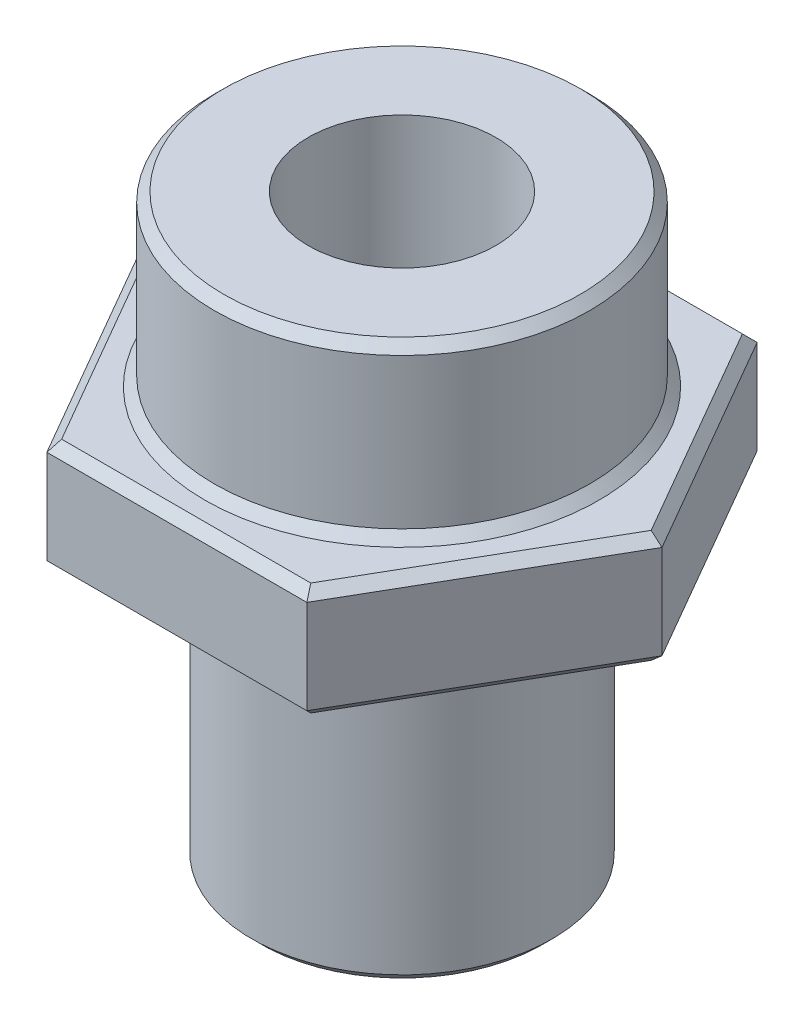
ISO-10303-21;
HEADER;
FILE_DESCRIPTION(('STEP AP214'),'2;1');
FILE_NAME('part.step','',(''),(''),'','','');
FILE_SCHEMA(('AUTOMOTIVE_DESIGN { 1 0 10303 214 1 1 1 1 }'));
ENDSEC;
DATA;
#1=APPLICATION_CONTEXT('core data for automotive mechanical design processes');
#2=APPLICATION_PROTOCOL_DEFINITION('international standard','automotive_design',2000,#1);
#3=PRODUCT_CONTEXT('',#1,'mechanical');
#4=PRODUCT('Part','Part','',(#3));
#5=PRODUCT_RELATED_PRODUCT_CATEGORY('part','',(#4));
#6=PRODUCT_DEFINITION_FORMATION('','',#4);
#7=PRODUCT_DEFINITION_CONTEXT('part definition',#1,'design');
#8=PRODUCT_DEFINITION('design','',#6,#7);
#9=PRODUCT_DEFINITION_SHAPE('','',#8);
#10=(LENGTH_UNIT() NAMED_UNIT(*) SI_UNIT(.MILLI.,.METRE.));
#11=(NAMED_UNIT(*) PLANE_ANGLE_UNIT() SI_UNIT($,.RADIAN.));
#12=(NAMED_UNIT(*) SI_UNIT($,.STERADIAN.) SOLID_ANGLE_UNIT());
#13=UNCERTAINTY_MEASURE_WITH_UNIT(LENGTH_MEASURE(1.E-05),#10,'distance_accuracy_value','');
#14=(GEOMETRIC_REPRESENTATION_CONTEXT(3) GLOBAL_UNCERTAINTY_ASSIGNED_CONTEXT((#13)) GLOBAL_UNIT_ASSIGNED_CONTEXT((#10,
#11,#12)) REPRESENTATION_CONTEXT('',''));
#15=CARTESIAN_POINT('',(0.,0.,0.));
#16=DIRECTION('',(0.,0.,1.));
#17=DIRECTION('',(1.,0.,0.));
#18=AXIS2_PLACEMENT_3D('',#15,#16,#17);
#19=CARTESIAN_POINT('',(0.,0.,0.));
#20=DIRECTION('',(0.,1.,0.));
#21=DIRECTION('',(0.,0.,1.));
#22=AXIS2_PLACEMENT_3D('',#19,#20,#21);
#23=CYLINDRICAL_SURFACE('',#22,2.5);
#24=CARTESIAN_POINT('',(0.,-7.5,0.));
#25=DIRECTION('',(0.,-1.,0.));
#26=DIRECTION('',(0.,0.,-1.));
#27=AXIS2_PLACEMENT_3D('',#24,#25,#26);
#28=CIRCLE('',#27,2.5);
#29=CARTESIAN_POINT('',(0.,-7.5,-2.5));
#30=VERTEX_POINT('',#29);
#31=EDGE_CURVE('E342',#30,#30,#28,.T.);
#32=ORIENTED_EDGE('',*,*,#31,.F.);
#33=EDGE_LOOP('',(#32));
#34=FACE_BOUND('',#33,.T.);
#35=CARTESIAN_POINT('',(0.,-15.5,0.));
#36=DIRECTION('',(0.,1.,0.));
#37=DIRECTION('',(0.,0.,1.));
#38=AXIS2_PLACEMENT_3D('',#35,#36,#37);
#39=CIRCLE('',#38,2.5);
#40=CARTESIAN_POINT('',(0.,-15.5,2.5));
#41=VERTEX_POINT('',#40);
#42=EDGE_CURVE('E341',#41,#41,#39,.T.);
#43=ORIENTED_EDGE('',*,*,#42,.F.);
#44=EDGE_LOOP('',(#43));
#45=FACE_BOUND('',#44,.T.);
#46=ADVANCED_FACE('F45',(#34,#45),#23,.F.);
#47=CARTESIAN_POINT('',(-6.,-7.5,0.));
#48=DIRECTION('',(0.,-1.,0.));
#49=DIRECTION('',(0.,0.,-1.));
#50=AXIS2_PLACEMENT_3D('',#47,#48,#49);
#51=PLANE('',#50);
#52=DIRECTION('',(0.5,0.,0.866025403784439));
#53=VECTOR('',#52,1.);
#54=CARTESIAN_POINT('',(3.47964607176053,-7.5,-5.47307621135332));
#55=LINE('',#54,#53);
#56=CARTESIAN_POINT('',(3.31976404784035,-7.5,-5.75000000000001));
#57=VERTEX_POINT('',#56);
#58=CARTESIAN_POINT('',(6.6395280956807,-7.5,0.));
#59=VERTEX_POINT('',#58);
#60=EDGE_CURVE('E216',#57,#59,#55,.T.);
#61=ORIENTED_EDGE('',*,*,#60,.T.);
#62=DIRECTION('',(-0.5,0.,0.866025403784439));
#63=VECTOR('',#62,1.);
#64=CARTESIAN_POINT('',(3.47964607176053,-7.5,5.47307621135332));
#65=LINE('',#64,#63);
#66=CARTESIAN_POINT('',(3.31976404784035,-7.5,5.75));
#67=VERTEX_POINT('',#66);
#68=EDGE_CURVE('E230',#59,#67,#65,.T.);
#69=ORIENTED_EDGE('',*,*,#68,.T.);
#70=DIRECTION('',(-1.,0.,0.));
#71=VECTOR('',#70,1.);
#72=CARTESIAN_POINT('',(-6.,-7.5,5.75));
#73=LINE('',#72,#71);
#74=CARTESIAN_POINT('',(-3.31976404784035,-7.5,5.75));
#75=VERTEX_POINT('',#74);
#76=EDGE_CURVE('E71',#67,#75,#73,.T.);
#77=ORIENTED_EDGE('',*,*,#76,.T.);
#78=DIRECTION('',(-0.5,0.,-0.866025403784439));
#79=VECTOR('',#78,1.);
#80=CARTESIAN_POINT('',(-6.47964607176053,-7.5,0.276923788646686));
#81=LINE('',#80,#79);
#82=CARTESIAN_POINT('',(-6.6395280956807,-7.5,0.));
#83=VERTEX_POINT('',#82);
#84=EDGE_CURVE('E225',#75,#83,#81,.T.);
#85=ORIENTED_EDGE('',*,*,#84,.T.);
#86=DIRECTION('',(0.5,0.,-0.866025403784439));
#87=VECTOR('',#86,1.);
#88=CARTESIAN_POINT('',(-6.47964607176053,-7.5,-0.276923788646688));
#89=LINE('',#88,#87);
#90=CARTESIAN_POINT('',(-3.31976404784035,-7.5,-5.75000000000001));
#91=VERTEX_POINT('',#90);
#92=EDGE_CURVE('E222',#83,#91,#89,.T.);
#93=ORIENTED_EDGE('',*,*,#92,.T.);
#94=DIRECTION('',(1.,0.,0.));
#95=VECTOR('',#94,1.);
#96=CARTESIAN_POINT('',(-6.,-7.5,-5.75000000000001));
#97=LINE('',#96,#95);
#98=EDGE_CURVE('E219',#91,#57,#97,.T.);
#99=ORIENTED_EDGE('',*,*,#98,.T.);
#100=EDGE_LOOP('',(#61,#69,#77,#85,#93,#99));
#101=FACE_BOUND('',#100,.T.);
#102=CARTESIAN_POINT('',(0.,-7.5,0.));
#103=DIRECTION('',(0.,-1.,0.));
#104=DIRECTION('',(0.,0.,-1.));
#105=AXIS2_PLACEMENT_3D('',#102,#103,#104);
#106=CIRCLE('',#105,4.25);
#107=CARTESIAN_POINT('',(0.,-7.5,-4.25));
#108=VERTEX_POINT('',#107);
#109=EDGE_CURVE('E212',#108,#108,#106,.F.);
#110=ORIENTED_EDGE('',*,*,#109,.T.);
#111=EDGE_LOOP('',(#110));
#112=FACE_BOUND('',#111,.T.);
#113=ADVANCED_FACE('F299',(#101,#112),#51,.T.);
#114=CARTESIAN_POINT('',(0.,0.,0.));
#115=DIRECTION('',(0.,1.,0.));
#116=DIRECTION('',(0.,0.,1.));
#117=AXIS2_PLACEMENT_3D('',#114,#115,#116);
#118=CYLINDRICAL_SURFACE('',#117,4.);
#119=CARTESIAN_POINT('',(0.,-15.25,0.));
#120=DIRECTION('',(0.,-1.,0.));
#121=DIRECTION('',(0.,0.,-1.));
#122=AXIS2_PLACEMENT_3D('',#119,#120,#121);
#123=CIRCLE('',#122,4.);
#124=CARTESIAN_POINT('',(0.,-15.25,-4.));
#125=VERTEX_POINT('',#124);
#126=EDGE_CURVE('E237',#125,#125,#123,.F.);
#127=ORIENTED_EDGE('',*,*,#126,.T.);
#128=EDGE_LOOP('',(#127));
#129=FACE_BOUND('',#128,.T.);
#130=CARTESIAN_POINT('',(0.,-7.75,0.));
#131=DIRECTION('',(0.,-1.,0.));
#132=DIRECTION('',(0.,0.,-1.));
#133=AXIS2_PLACEMENT_3D('',#130,#131,#132);
#134=CIRCLE('',#133,4.);
#135=CARTESIAN_POINT('',(0.,-7.75,-4.));
#136=VERTEX_POINT('',#135);
#137=EDGE_CURVE('E233',#136,#136,#134,.T.);
#138=ORIENTED_EDGE('',*,*,#137,.T.);
#139=EDGE_LOOP('',(#138));
#140=FACE_BOUND('',#139,.T.);
#141=ADVANCED_FACE('F408',(#129,#140),#118,.T.);
#142=CARTESIAN_POINT('',(-4.,-15.5,0.));
#143=DIRECTION('',(0.,-1.,0.));
#144=DIRECTION('',(0.,0.,-1.));
#145=AXIS2_PLACEMENT_3D('',#142,#143,#144);
#146=PLANE('',#145);
#147=CARTESIAN_POINT('',(0.,-15.5,0.));
#148=DIRECTION('',(0.,-1.,0.));
#149=DIRECTION('',(0.,0.,-1.));
#150=AXIS2_PLACEMENT_3D('',#147,#148,#149);
#151=CIRCLE('',#150,3.75);
#152=CARTESIAN_POINT('',(0.,-15.5,-3.75));
#153=VERTEX_POINT('',#152);
#154=EDGE_CURVE('E241',#153,#153,#151,.T.);
#155=ORIENTED_EDGE('',*,*,#154,.T.);
#156=EDGE_LOOP('',(#155));
#157=FACE_BOUND('',#156,.T.);
#158=ORIENTED_EDGE('',*,*,#42,.T.);
#159=EDGE_LOOP('',(#158));
#160=FACE_BOUND('',#159,.T.);
#161=ADVANCED_FACE('F441',(#157,#160),#146,.T.);
#162=CARTESIAN_POINT('',(3.46410161513776,-25.8303027798234,-6.));
#163=DIRECTION('',(0.,0.,-1.));
#164=DIRECTION('',(-1.,0.,0.));
#165=AXIS2_PLACEMENT_3D('',#162,#163,#164);
#166=PLANE('',#165);
#167=DIRECTION('',(0.,1.,0.));
#168=VECTOR('',#167,1.);
#169=CARTESIAN_POINT('',(-3.46410161513776,-25.8303027798234,-6.));
#170=LINE('',#169,#168);
#171=CARTESIAN_POINT('',(-3.46410161513776,-7.25,-6.));
#172=VERTEX_POINT('',#171);
#173=CARTESIAN_POINT('',(-3.46410161513776,-4.75,-6.));
#174=VERTEX_POINT('',#173);
#175=EDGE_CURVE('E327',#172,#174,#170,.T.);
#176=ORIENTED_EDGE('',*,*,#175,.T.);
#177=DIRECTION('',(1.,0.,0.));
#178=VECTOR('',#177,1.);
#179=CARTESIAN_POINT('',(3.46410161513776,-4.75,-6.));
#180=LINE('',#179,#178);
#181=CARTESIAN_POINT('',(3.46410161513776,-4.75,-6.));
#182=VERTEX_POINT('',#181);
#183=EDGE_CURVE('E196',#174,#182,#180,.T.);
#184=ORIENTED_EDGE('',*,*,#183,.T.);
#185=DIRECTION('',(0.,1.,0.));
#186=VECTOR('',#185,1.);
#187=CARTESIAN_POINT('',(3.46410161513776,-25.8303027798234,-6.));
#188=LINE('',#187,#186);
#189=CARTESIAN_POINT('',(3.46410161513776,-7.25,-6.));
#190=VERTEX_POINT('',#189);
#191=EDGE_CURVE('E323',#190,#182,#188,.T.);
#192=ORIENTED_EDGE('',*,*,#191,.F.);
#193=DIRECTION('',(-1.,0.,0.));
#194=VECTOR('',#193,1.);
#195=CARTESIAN_POINT('',(3.46410161513776,-7.25,-6.));
#196=LINE('',#195,#194);
#197=EDGE_CURVE('E193',#190,#172,#196,.T.);
#198=ORIENTED_EDGE('',*,*,#197,.T.);
#199=EDGE_LOOP('',(#176,#184,#192,#198));
#200=FACE_BOUND('',#199,.T.);
#201=ADVANCED_FACE('F386',(#200),#166,.T.);
#202=CARTESIAN_POINT('',(6.92820323027551,-25.8303027798234,0.));
#203=DIRECTION('',(0.866025403784439,0.,-0.5));
#204=DIRECTION('',(-0.5,0.,-0.866025403784439));
#205=AXIS2_PLACEMENT_3D('',#202,#203,#204);
#206=PLANE('',#205);
#207=ORIENTED_EDGE('',*,*,#191,.T.);
#208=DIRECTION('',(0.5,0.,0.866025403784439));
#209=VECTOR('',#208,1.);
#210=CARTESIAN_POINT('',(6.92820323027551,-4.75,0.));
#211=LINE('',#210,#209);
#212=CARTESIAN_POINT('',(6.92820323027551,-4.75,0.));
#213=VERTEX_POINT('',#212);
#214=EDGE_CURVE('E202',#182,#213,#211,.T.);
#215=ORIENTED_EDGE('',*,*,#214,.T.);
#216=DIRECTION('',(0.,1.,0.));
#217=VECTOR('',#216,1.);
#218=CARTESIAN_POINT('',(6.92820323027551,-25.8303027798234,0.));
#219=LINE('',#218,#217);
#220=CARTESIAN_POINT('',(6.92820323027551,-7.25,0.));
#221=VERTEX_POINT('',#220);
#222=EDGE_CURVE('E314',#221,#213,#219,.T.);
#223=ORIENTED_EDGE('',*,*,#222,.F.);
#224=DIRECTION('',(-0.5,0.,-0.866025403784439));
#225=VECTOR('',#224,1.);
#226=CARTESIAN_POINT('',(6.92820323027551,-7.25,0.));
#227=LINE('',#226,#225);
#228=EDGE_CURVE('E199',#221,#190,#227,.T.);
#229=ORIENTED_EDGE('',*,*,#228,.T.);
#230=EDGE_LOOP('',(#207,#215,#223,#229));
#231=FACE_BOUND('',#230,.T.);
#232=ADVANCED_FACE('F319',(#231),#206,.T.);
#233=CARTESIAN_POINT('',(3.46410161513776,-25.8303027798234,6.));
#234=DIRECTION('',(0.866025403784439,0.,0.5));
#235=DIRECTION('',(0.5,0.,-0.866025403784439));
#236=AXIS2_PLACEMENT_3D('',#233,#234,#235);
#237=PLANE('',#236);
#238=ORIENTED_EDGE('',*,*,#222,.T.);
#239=DIRECTION('',(-0.5,0.,0.866025403784439));
#240=VECTOR('',#239,1.);
#241=CARTESIAN_POINT('',(3.46410161513776,-4.75,6.));
#242=LINE('',#241,#240);
#243=CARTESIAN_POINT('',(3.46410161513776,-4.75,6.));
#244=VERTEX_POINT('',#243);
#245=EDGE_CURVE('E209',#213,#244,#242,.T.);
#246=ORIENTED_EDGE('',*,*,#245,.T.);
#247=DIRECTION('',(0.,1.,0.));
#248=VECTOR('',#247,1.);
#249=CARTESIAN_POINT('',(3.46410161513776,-25.8303027798234,6.));
#250=LINE('',#249,#248);
#251=CARTESIAN_POINT('',(3.46410161513776,-7.25,6.));
#252=VERTEX_POINT('',#251);
#253=EDGE_CURVE('E316',#252,#244,#250,.T.);
#254=ORIENTED_EDGE('',*,*,#253,.F.);
#255=DIRECTION('',(0.5,0.,-0.866025403784439));
#256=VECTOR('',#255,1.);
#257=CARTESIAN_POINT('',(3.46410161513776,-7.25,6.));
#258=LINE('',#257,#256);
#259=EDGE_CURVE('E205',#252,#221,#258,.T.);
#260=ORIENTED_EDGE('',*,*,#259,.T.);
#261=EDGE_LOOP('',(#238,#246,#254,#260));
#262=FACE_BOUND('',#261,.T.);
#263=ADVANCED_FACE('F313',(#262),#237,.T.);
#264=CARTESIAN_POINT('',(-3.46410161513776,-25.8303027798234,6.));
#265=DIRECTION('',(0.,0.,1.));
#266=DIRECTION('',(1.,0.,0.));
#267=AXIS2_PLACEMENT_3D('',#264,#265,#266);
#268=PLANE('',#267);
#269=ORIENTED_EDGE('',*,*,#253,.T.);
#270=DIRECTION('',(-1.,0.,0.));
#271=VECTOR('',#270,1.);
#272=CARTESIAN_POINT('',(-3.46410161513776,-4.75,6.));
#273=LINE('',#272,#271);
#274=CARTESIAN_POINT('',(-3.46410161513776,-4.75,6.));
#275=VERTEX_POINT('',#274);
#276=EDGE_CURVE('E147',#244,#275,#273,.T.);
#277=ORIENTED_EDGE('',*,*,#276,.T.);
#278=DIRECTION('',(0.,1.,0.));
#279=VECTOR('',#278,1.);
#280=CARTESIAN_POINT('',(-3.46410161513776,-25.8303027798234,6.));
#281=LINE('',#280,#279);
#282=CARTESIAN_POINT('',(-3.46410161513776,-7.25,6.));
#283=VERTEX_POINT('',#282);
#284=EDGE_CURVE('E329',#283,#275,#281,.T.);
#285=ORIENTED_EDGE('',*,*,#284,.F.);
#286=DIRECTION('',(1.,0.,0.));
#287=VECTOR('',#286,1.);
#288=CARTESIAN_POINT('',(-3.46410161513776,-7.25,6.));
#289=LINE('',#288,#287);
#290=EDGE_CURVE('E170',#283,#252,#289,.T.);
#291=ORIENTED_EDGE('',*,*,#290,.T.);
#292=EDGE_LOOP('',(#269,#277,#285,#291));
#293=FACE_BOUND('',#292,.T.);
#294=ADVANCED_FACE('F379',(#293),#268,.T.);
#295=CARTESIAN_POINT('',(-6.92820323027551,-25.8303027798234,0.));
#296=DIRECTION('',(-0.866025403784438,0.,0.5));
#297=DIRECTION('',(0.5,0.,0.866025403784439));
#298=AXIS2_PLACEMENT_3D('',#295,#296,#297);
#299=PLANE('',#298);
#300=ORIENTED_EDGE('',*,*,#284,.T.);
#301=DIRECTION('',(-0.5,0.,-0.866025403784439));
#302=VECTOR('',#301,1.);
#303=CARTESIAN_POINT('',(-6.92820323027551,-4.75,0.));
#304=LINE('',#303,#302);
#305=CARTESIAN_POINT('',(-6.92820323027551,-4.75,0.));
#306=VERTEX_POINT('',#305);
#307=EDGE_CURVE('E184',#275,#306,#304,.T.);
#308=ORIENTED_EDGE('',*,*,#307,.T.);
#309=DIRECTION('',(0.,1.,0.));
#310=VECTOR('',#309,1.);
#311=CARTESIAN_POINT('',(-6.92820323027551,-25.8303027798234,0.));
#312=LINE('',#311,#310);
#313=CARTESIAN_POINT('',(-6.92820323027551,-7.25,0.));
#314=VERTEX_POINT('',#313);
#315=EDGE_CURVE('E268',#314,#306,#312,.T.);
#316=ORIENTED_EDGE('',*,*,#315,.F.);
#317=DIRECTION('',(0.5,0.,0.866025403784439));
#318=VECTOR('',#317,1.);
#319=CARTESIAN_POINT('',(-6.92820323027551,-7.25,0.));
#320=LINE('',#319,#318);
#321=EDGE_CURVE('E181',#314,#283,#320,.T.);
#322=ORIENTED_EDGE('',*,*,#321,.T.);
#323=EDGE_LOOP('',(#300,#308,#316,#322));
#324=FACE_BOUND('',#323,.T.);
#325=ADVANCED_FACE('F380',(#324),#299,.T.);
#326=CARTESIAN_POINT('',(-3.46410161513776,-25.8303027798234,-6.));
#327=DIRECTION('',(-0.866025403784438,0.,-0.5));
#328=DIRECTION('',(-0.5,0.,0.866025403784439));
#329=AXIS2_PLACEMENT_3D('',#326,#327,#328);
#330=PLANE('',#329);
#331=ORIENTED_EDGE('',*,*,#315,.T.);
#332=DIRECTION('',(0.5,0.,-0.866025403784439));
#333=VECTOR('',#332,1.);
#334=CARTESIAN_POINT('',(-3.46410161513776,-4.75,-6.));
#335=LINE('',#334,#333);
#336=EDGE_CURVE('E190',#306,#174,#335,.T.);
#337=ORIENTED_EDGE('',*,*,#336,.T.);
#338=ORIENTED_EDGE('',*,*,#175,.F.);
#339=DIRECTION('',(-0.5,0.,0.866025403784439));
#340=VECTOR('',#339,1.);
#341=CARTESIAN_POINT('',(-3.46410161513776,-7.25,-6.));
#342=LINE('',#341,#340);
#343=EDGE_CURVE('E187',#172,#314,#342,.T.);
#344=ORIENTED_EDGE('',*,*,#343,.T.);
#345=EDGE_LOOP('',(#331,#337,#338,#344));
#346=FACE_BOUND('',#345,.T.);
#347=ADVANCED_FACE('F382',(#346),#330,.T.);
#348=ORIENTED_EDGE('',*,*,#31,.T.);
#349=EDGE_LOOP('',(#348));
#350=FACE_BOUND('',#349,.T.);
#351=ADVANCED_FACE('F410',(#350),#51,.T.);
#352=CARTESIAN_POINT('',(0.,0.,0.));
#353=DIRECTION('',(0.,1.,0.));
#354=DIRECTION('',(0.,0.,1.));
#355=AXIS2_PLACEMENT_3D('',#352,#353,#354);
#356=CYLINDRICAL_SURFACE('',#355,5.);
#357=CARTESIAN_POINT('',(0.,-4.24999999999999,0.));
#358=DIRECTION('',(0.,1.,0.));
#359=DIRECTION('',(0.,0.,1.));
#360=AXIS2_PLACEMENT_3D('',#357,#358,#359);
#361=CIRCLE('',#360,5.);
#362=CARTESIAN_POINT('',(0.,-4.24999999999999,5.));
#363=VERTEX_POINT('',#362);
#364=EDGE_CURVE('E56',#363,#363,#361,.T.);
#365=ORIENTED_EDGE('',*,*,#364,.T.);
#366=EDGE_LOOP('',(#365));
#367=FACE_BOUND('',#366,.T.);
#368=CARTESIAN_POINT('',(0.,-0.250000000000003,0.));
#369=DIRECTION('',(0.,1.,0.));
#370=DIRECTION('',(0.,0.,1.));
#371=AXIS2_PLACEMENT_3D('',#368,#369,#370);
#372=CIRCLE('',#371,5.);
#373=CARTESIAN_POINT('',(0.,-0.250000000000003,5.));
#374=VERTEX_POINT('',#373);
#375=EDGE_CURVE('E245',#374,#374,#372,.F.);
#376=ORIENTED_EDGE('',*,*,#375,.T.);
#377=EDGE_LOOP('',(#376));
#378=FACE_BOUND('',#377,.T.);
#379=ADVANCED_FACE('F433',(#367,#378),#356,.T.);
#380=CARTESIAN_POINT('',(-5.,-4.5,0.));
#381=DIRECTION('',(0.,1.,0.));
#382=DIRECTION('',(0.,0.,1.));
#383=AXIS2_PLACEMENT_3D('',#380,#381,#382);
#384=PLANE('',#383);
#385=DIRECTION('',(0.5,0.,0.866025403784439));
#386=VECTOR('',#385,1.);
#387=CARTESIAN_POINT('',(-6.22964607176052,-4.5,0.709936490538904));
#388=LINE('',#387,#386);
#389=CARTESIAN_POINT('',(-6.6395280956807,-4.5,0.));
#390=VERTEX_POINT('',#389);
#391=CARTESIAN_POINT('',(-3.31976404784035,-4.5,5.75));
#392=VERTEX_POINT('',#391);
#393=EDGE_CURVE('E167',#390,#392,#388,.T.);
#394=ORIENTED_EDGE('',*,*,#393,.T.);
#395=DIRECTION('',(1.,0.,0.));
#396=VECTOR('',#395,1.);
#397=CARTESIAN_POINT('',(-5.,-4.5,5.75));
#398=LINE('',#397,#396);
#399=CARTESIAN_POINT('',(3.31976404784035,-4.5,5.75));
#400=VERTEX_POINT('',#399);
#401=EDGE_CURVE('E145',#392,#400,#398,.T.);
#402=ORIENTED_EDGE('',*,*,#401,.T.);
#403=DIRECTION('',(0.5,0.,-0.866025403784439));
#404=VECTOR('',#403,1.);
#405=CARTESIAN_POINT('',(3.72964607176052,-4.5,5.0400635094611));
#406=LINE('',#405,#404);
#407=CARTESIAN_POINT('',(6.6395280956807,-4.5,0.));
#408=VERTEX_POINT('',#407);
#409=EDGE_CURVE('E154',#400,#408,#406,.T.);
#410=ORIENTED_EDGE('',*,*,#409,.T.);
#411=DIRECTION('',(-0.5,0.,-0.866025403784439));
#412=VECTOR('',#411,1.);
#413=CARTESIAN_POINT('',(3.72964607176052,-4.5,-5.04006350946109));
#414=LINE('',#413,#412);
#415=CARTESIAN_POINT('',(3.31976404784035,-4.5,-5.75));
#416=VERTEX_POINT('',#415);
#417=EDGE_CURVE('E161',#408,#416,#414,.T.);
#418=ORIENTED_EDGE('',*,*,#417,.T.);
#419=DIRECTION('',(-1.,0.,0.));
#420=VECTOR('',#419,1.);
#421=CARTESIAN_POINT('',(-5.,-4.5,-5.75));
#422=LINE('',#421,#420);
#423=CARTESIAN_POINT('',(-3.31976404784035,-4.5,-5.75));
#424=VERTEX_POINT('',#423);
#425=EDGE_CURVE('E362',#416,#424,#422,.T.);
#426=ORIENTED_EDGE('',*,*,#425,.T.);
#427=DIRECTION('',(-0.5,0.,0.866025403784439));
#428=VECTOR('',#427,1.);
#429=CARTESIAN_POINT('',(-6.22964607176053,-4.5,-0.709936490538906));
#430=LINE('',#429,#428);
#431=EDGE_CURVE('E175',#424,#390,#430,.T.);
#432=ORIENTED_EDGE('',*,*,#431,.T.);
#433=EDGE_LOOP('',(#394,#402,#410,#418,#426,#432));
#434=FACE_BOUND('',#433,.T.);
#435=CARTESIAN_POINT('',(0.,-4.5,0.));
#436=DIRECTION('',(0.,1.,0.));
#437=DIRECTION('',(0.,0.,1.));
#438=AXIS2_PLACEMENT_3D('',#435,#436,#437);
#439=CIRCLE('',#438,5.25);
#440=CARTESIAN_POINT('',(0.,-4.5,5.25));
#441=VERTEX_POINT('',#440);
#442=EDGE_CURVE('E162',#441,#441,#439,.F.);
#443=ORIENTED_EDGE('',*,*,#442,.T.);
#444=EDGE_LOOP('',(#443));
#445=FACE_BOUND('',#444,.T.);
#446=ADVANCED_FACE('F164',(#434,#445),#384,.T.);
#447=CARTESIAN_POINT('',(-5.,0.,0.));
#448=DIRECTION('',(0.,1.,0.));
#449=DIRECTION('',(0.,0.,1.));
#450=AXIS2_PLACEMENT_3D('',#447,#448,#449);
#451=PLANE('',#450);
#452=CARTESIAN_POINT('',(0.,0.,0.));
#453=DIRECTION('',(0.,1.,0.));
#454=DIRECTION('',(0.,0.,1.));
#455=AXIS2_PLACEMENT_3D('',#452,#453,#454);
#456=CIRCLE('',#455,4.75);
#457=CARTESIAN_POINT('',(0.,0.,4.75));
#458=VERTEX_POINT('',#457);
#459=EDGE_CURVE('E11',#458,#458,#456,.T.);
#460=ORIENTED_EDGE('',*,*,#459,.T.);
#461=EDGE_LOOP('',(#460));
#462=FACE_BOUND('',#461,.T.);
#463=CARTESIAN_POINT('',(0.,0.,0.));
#464=DIRECTION('',(0.,1.,0.));
#465=DIRECTION('',(0.,0.,1.));
#466=AXIS2_PLACEMENT_3D('',#463,#464,#465);
#467=CIRCLE('',#466,2.5);
#468=CARTESIAN_POINT('',(0.,0.,2.5));
#469=VERTEX_POINT('',#468);
#470=EDGE_CURVE('E350',#469,#469,#467,.T.);
#471=ORIENTED_EDGE('',*,*,#470,.F.);
#472=EDGE_LOOP('',(#471));
#473=FACE_BOUND('',#472,.T.);
#474=ADVANCED_FACE('F417',(#462,#473),#451,.T.);
#475=CARTESIAN_POINT('',(0.,-4.5,0.));
#476=DIRECTION('',(0.,1.,0.));
#477=DIRECTION('',(0.,0.,1.));
#478=AXIS2_PLACEMENT_3D('',#475,#476,#477);
#479=CIRCLE('',#478,2.5);
#480=CARTESIAN_POINT('',(0.,-4.5,2.5));
#481=VERTEX_POINT('',#480);
#482=EDGE_CURVE('E346',#481,#481,#479,.T.);
#483=ORIENTED_EDGE('',*,*,#482,.F.);
#484=EDGE_LOOP('',(#483));
#485=FACE_BOUND('',#484,.T.);
#486=ORIENTED_EDGE('',*,*,#470,.T.);
#487=EDGE_LOOP('',(#486));
#488=FACE_BOUND('',#487,.T.);
#489=ADVANCED_FACE('F404',(#485,#488),#23,.F.);
#490=CARTESIAN_POINT('',(0.,-4.5,0.));
#491=DIRECTION('',(0.,1.,0.));
#492=DIRECTION('',(0.,0.,1.));
#493=AXIS2_PLACEMENT_3D('',#490,#491,#492);
#494=PLANE('',#493);
#495=ORIENTED_EDGE('',*,*,#482,.T.);
#496=EDGE_LOOP('',(#495));
#497=FACE_BOUND('',#496,.T.);
#498=ADVANCED_FACE('F416',(#497),#494,.T.);
#499=CARTESIAN_POINT('',(-5.,-4.5,-5.75));
#500=DIRECTION('',(0.,-0.707106781186544,0.707106781186551));
#501=DIRECTION('',(-1.,0.,0.));
#502=AXIS2_PLACEMENT_3D('',#499,#500,#501);
#503=PLANE('',#502);
#504=DIRECTION('',(-0.37796447300923,0.65465367070798,0.654653670707973));
#505=VECTOR('',#504,1.);
#506=CARTESIAN_POINT('',(3.20265489814887,-4.29716100270317,-5.54716100270318));
#507=LINE('',#506,#505);
#508=EDGE_CURVE('E260',#182,#416,#507,.T.);
#509=ORIENTED_EDGE('',*,*,#508,.F.);
#510=ORIENTED_EDGE('',*,*,#183,.F.);
#511=DIRECTION('',(0.377964473009223,0.654653670707982,0.654653670707975));
#512=VECTOR('',#511,1.);
#513=CARTESIAN_POINT('',(-3.55979775529172,-4.91575057683491,-6.16575057683491));
#514=LINE('',#513,#512);
#515=EDGE_CURVE('E264',#424,#174,#514,.F.);
#516=ORIENTED_EDGE('',*,*,#515,.F.);
#517=ORIENTED_EDGE('',*,*,#425,.F.);
#518=EDGE_LOOP('',(#509,#510,#516,#517));
#519=FACE_BOUND('',#518,.T.);
#520=ADVANCED_FACE('F389',(#519),#503,.F.);
#521=CARTESIAN_POINT('',(-6.22964607176053,-4.5,-0.709936490538906));
#522=DIRECTION('',(0.612372435695799,-0.707106781186542,0.353553390593276));
#523=DIRECTION('',(-0.5,0.,0.866025403784439));
#524=AXIS2_PLACEMENT_3D('',#521,#522,#523);
#525=PLANE('',#524);
#526=ORIENTED_EDGE('',*,*,#515,.T.);
#527=ORIENTED_EDGE('',*,*,#336,.F.);
#528=DIRECTION('',(0.755928946018451,0.654653670707982,0.));
#529=VECTOR('',#528,1.);
#530=CARTESIAN_POINT('',(-6.40530979629774,-4.29716100270317,0.));
#531=LINE('',#530,#529);
#532=EDGE_CURVE('E256',#390,#306,#531,.F.);
#533=ORIENTED_EDGE('',*,*,#532,.F.);
#534=ORIENTED_EDGE('',*,*,#431,.F.);
#535=EDGE_LOOP('',(#526,#527,#533,#534));
#536=FACE_BOUND('',#535,.T.);
#537=ADVANCED_FACE('F371',(#536),#525,.F.);
#538=CARTESIAN_POINT('',(3.72964607176052,-4.5,-5.0400635094611));
#539=DIRECTION('',(-0.612372435695796,-0.707106781186546,0.353553390593274));
#540=DIRECTION('',(-0.5,0.,-0.866025403784439));
#541=AXIS2_PLACEMENT_3D('',#538,#539,#540);
#542=PLANE('',#541);
#543=ORIENTED_EDGE('',*,*,#508,.T.);
#544=ORIENTED_EDGE('',*,*,#417,.F.);
#545=DIRECTION('',(-0.755928946018452,0.65465367070798,0.));
#546=VECTOR('',#545,1.);
#547=CARTESIAN_POINT('',(4.9767383677263,-3.05998185443966,0.));
#548=LINE('',#547,#546);
#549=EDGE_CURVE('E157',#213,#408,#548,.T.);
#550=ORIENTED_EDGE('',*,*,#549,.F.);
#551=ORIENTED_EDGE('',*,*,#214,.F.);
#552=EDGE_LOOP('',(#543,#544,#550,#551));
#553=FACE_BOUND('',#552,.T.);
#554=ADVANCED_FACE('F391',(#553),#542,.F.);
#555=CARTESIAN_POINT('',(-6.22964607176052,-4.5,0.709936490538904));
#556=DIRECTION('',(0.612372435695797,-0.707106781186544,-0.353553390593276));
#557=DIRECTION('',(0.5,0.,0.866025403784439));
#558=AXIS2_PLACEMENT_3D('',#555,#556,#557);
#559=PLANE('',#558);
#560=ORIENTED_EDGE('',*,*,#532,.T.);
#561=ORIENTED_EDGE('',*,*,#307,.F.);
#562=DIRECTION('',(0.377964473009226,0.654653670707981,-0.654653670707974));
#563=VECTOR('',#562,1.);
#564=CARTESIAN_POINT('',(-2.48836918386316,-3.05998185443969,4.3099818544397));
#565=LINE('',#564,#563);
#566=EDGE_CURVE('E151',#392,#275,#565,.F.);
#567=ORIENTED_EDGE('',*,*,#566,.F.);
#568=ORIENTED_EDGE('',*,*,#393,.F.);
#569=EDGE_LOOP('',(#560,#561,#567,#568));
#570=FACE_BOUND('',#569,.T.);
#571=ADVANCED_FACE('F374',(#570),#559,.F.);
#572=CARTESIAN_POINT('',(3.72964607176052,-4.5,5.0400635094611));
#573=DIRECTION('',(-0.612372435695798,-0.707106781186543,-0.353553390593276));
#574=DIRECTION('',(0.5,0.,-0.866025403784439));
#575=AXIS2_PLACEMENT_3D('',#572,#573,#574);
#576=PLANE('',#575);
#577=ORIENTED_EDGE('',*,*,#549,.T.);
#578=ORIENTED_EDGE('',*,*,#409,.F.);
#579=DIRECTION('',(0.377964473009224,-0.654653670707982,0.654653670707975));
#580=VECTOR('',#579,1.);
#581=CARTESIAN_POINT('',(3.20265489814887,-4.29716100270317,5.54716100270317));
#582=LINE('',#581,#580);
#583=EDGE_CURVE('E141',#244,#400,#582,.F.);
#584=ORIENTED_EDGE('',*,*,#583,.F.);
#585=ORIENTED_EDGE('',*,*,#245,.F.);
#586=EDGE_LOOP('',(#577,#578,#584,#585));
#587=FACE_BOUND('',#586,.T.);
#588=ADVANCED_FACE('F155',(#587),#576,.F.);
#589=CARTESIAN_POINT('',(-5.,-4.5,5.75));
#590=DIRECTION('',(0.,-0.707106781186544,-0.707106781186551));
#591=DIRECTION('',(1.,0.,0.));
#592=AXIS2_PLACEMENT_3D('',#589,#590,#591);
#593=PLANE('',#592);
#594=ORIENTED_EDGE('',*,*,#566,.T.);
#595=ORIENTED_EDGE('',*,*,#276,.F.);
#596=ORIENTED_EDGE('',*,*,#583,.T.);
#597=ORIENTED_EDGE('',*,*,#401,.F.);
#598=EDGE_LOOP('',(#594,#595,#596,#597));
#599=FACE_BOUND('',#598,.T.);
#600=ADVANCED_FACE('F143',(#599),#593,.F.);
#601=CARTESIAN_POINT('',(-3.46410161513776,-7.25,-6.));
#602=DIRECTION('',(0.612372435695796,0.707106781186546,0.353553390593275));
#603=DIRECTION('',(-0.5,0.,0.866025403784439));
#604=AXIS2_PLACEMENT_3D('',#601,#602,#603);
#605=PLANE('',#604);
#606=DIRECTION('',(-0.377964473009225,0.654653670707978,-0.654653670707978));
#607=VECTOR('',#606,1.);
#608=CARTESIAN_POINT('',(-2.47435829652698,-8.96428571428571,-4.2857142857143));
#609=LINE('',#608,#607);
#610=EDGE_CURVE('E281',#91,#172,#609,.T.);
#611=ORIENTED_EDGE('',*,*,#610,.F.);
#612=ORIENTED_EDGE('',*,*,#92,.F.);
#613=DIRECTION('',(-0.755928946018454,0.654653670707977,0.));
#614=VECTOR('',#613,1.);
#615=CARTESIAN_POINT('',(-4.94871659305392,-8.96428571428573,0.));
#616=LINE('',#615,#614);
#617=EDGE_CURVE('E50',#314,#83,#616,.F.);
#618=ORIENTED_EDGE('',*,*,#617,.F.);
#619=ORIENTED_EDGE('',*,*,#343,.F.);
#620=EDGE_LOOP('',(#611,#612,#618,#619));
#621=FACE_BOUND('',#620,.T.);
#622=ADVANCED_FACE('F298',(#621),#605,.F.);
#623=CARTESIAN_POINT('',(-6.92820323027551,-7.25,0.));
#624=DIRECTION('',(0.612372435695794,0.707106781186548,-0.353553390593273));
#625=DIRECTION('',(0.5,0.,0.866025403784439));
#626=AXIS2_PLACEMENT_3D('',#623,#624,#625);
#627=PLANE('',#626);
#628=ORIENTED_EDGE('',*,*,#617,.T.);
#629=ORIENTED_EDGE('',*,*,#84,.F.);
#630=DIRECTION('',(-0.377964473009229,0.654653670707977,0.654653670707977));
#631=VECTOR('',#630,1.);
#632=CARTESIAN_POINT('',(-2.47435829652697,-8.96428571428571,4.28571428571429));
#633=LINE('',#632,#631);
#634=EDGE_CURVE('E278',#283,#75,#633,.F.);
#635=ORIENTED_EDGE('',*,*,#634,.F.);
#636=ORIENTED_EDGE('',*,*,#321,.F.);
#637=EDGE_LOOP('',(#628,#629,#635,#636));
#638=FACE_BOUND('',#637,.T.);
#639=ADVANCED_FACE('F293',(#638),#627,.F.);
#640=CARTESIAN_POINT('',(3.46410161513776,-7.25,-6.));
#641=DIRECTION('',(0.,0.707106781186548,0.707106781186548));
#642=DIRECTION('',(-1.,0.,0.));
#643=AXIS2_PLACEMENT_3D('',#640,#641,#642);
#644=PLANE('',#643);
#645=ORIENTED_EDGE('',*,*,#610,.T.);
#646=ORIENTED_EDGE('',*,*,#197,.F.);
#647=DIRECTION('',(0.377964473009233,0.654653670707976,-0.654653670707976));
#648=VECTOR('',#647,1.);
#649=CARTESIAN_POINT('',(2.47435829652696,-8.9642857142857,-4.28571428571431));
#650=LINE('',#649,#648);
#651=EDGE_CURVE('E274',#57,#190,#650,.T.);
#652=ORIENTED_EDGE('',*,*,#651,.F.);
#653=ORIENTED_EDGE('',*,*,#98,.F.);
#654=EDGE_LOOP('',(#645,#646,#652,#653));
#655=FACE_BOUND('',#654,.T.);
#656=ADVANCED_FACE('F303',(#655),#644,.F.);
#657=CARTESIAN_POINT('',(-3.46410161513776,-7.25,6.));
#658=DIRECTION('',(0.,0.707106781186548,-0.707106781186548));
#659=DIRECTION('',(1.,0.,0.));
#660=AXIS2_PLACEMENT_3D('',#657,#658,#659);
#661=PLANE('',#660);
#662=ORIENTED_EDGE('',*,*,#634,.T.);
#663=ORIENTED_EDGE('',*,*,#76,.F.);
#664=DIRECTION('',(0.377964473009226,0.654653670707977,0.654653670707977));
#665=VECTOR('',#664,1.);
#666=CARTESIAN_POINT('',(2.47435829652697,-8.96428571428572,4.28571428571429));
#667=LINE('',#666,#665);
#668=EDGE_CURVE('E64',#252,#67,#667,.F.);
#669=ORIENTED_EDGE('',*,*,#668,.F.);
#670=ORIENTED_EDGE('',*,*,#290,.F.);
#671=EDGE_LOOP('',(#662,#663,#669,#670));
#672=FACE_BOUND('',#671,.T.);
#673=ADVANCED_FACE('F575',(#672),#661,.F.);
#674=CARTESIAN_POINT('',(6.92820323027551,-7.25,0.));
#675=DIRECTION('',(-0.612372435695792,0.707106781186551,0.353553390593272));
#676=DIRECTION('',(-0.5,0.,-0.866025403784439));
#677=AXIS2_PLACEMENT_3D('',#674,#675,#676);
#678=PLANE('',#677);
#679=ORIENTED_EDGE('',*,*,#651,.T.);
#680=ORIENTED_EDGE('',*,*,#228,.F.);
#681=DIRECTION('',(-0.755928946018456,-0.654653670707976,0.));
#682=VECTOR('',#681,1.);
#683=CARTESIAN_POINT('',(6.92820323027551,-7.25,0.));
#684=LINE('',#683,#682);
#685=EDGE_CURVE('E269',#59,#221,#684,.F.);
#686=ORIENTED_EDGE('',*,*,#685,.F.);
#687=ORIENTED_EDGE('',*,*,#60,.F.);
#688=EDGE_LOOP('',(#679,#680,#686,#687));
#689=FACE_BOUND('',#688,.T.);
#690=ADVANCED_FACE('F307',(#689),#678,.F.);
#691=CARTESIAN_POINT('',(3.46410161513776,-7.25,6.));
#692=DIRECTION('',(-0.612372435695795,0.707106781186547,-0.353553390593274));
#693=DIRECTION('',(0.5,0.,-0.866025403784439));
#694=AXIS2_PLACEMENT_3D('',#691,#692,#693);
#695=PLANE('',#694);
#696=ORIENTED_EDGE('',*,*,#668,.T.);
#697=ORIENTED_EDGE('',*,*,#68,.F.);
#698=ORIENTED_EDGE('',*,*,#685,.T.);
#699=ORIENTED_EDGE('',*,*,#259,.F.);
#700=EDGE_LOOP('',(#696,#697,#698,#699));
#701=FACE_BOUND('',#700,.T.);
#702=ADVANCED_FACE('F308',(#701),#695,.F.);
#703=CARTESIAN_POINT('',(0.,-15.25,0.));
#704=DIRECTION('',(0.,1.,0.));
#705=DIRECTION('',(0.,0.,1.));
#706=AXIS2_PLACEMENT_3D('',#703,#704,#705);
#707=CONICAL_SURFACE('',#706,4.,0.785398163397448);
#708=ORIENTED_EDGE('',*,*,#154,.F.);
#709=EDGE_LOOP('',(#708));
#710=FACE_BOUND('',#709,.T.);
#711=ORIENTED_EDGE('',*,*,#126,.F.);
#712=EDGE_LOOP('',(#711));
#713=FACE_BOUND('',#712,.T.);
#714=ADVANCED_FACE('F604',(#710,#713),#707,.T.);
#715=CARTESIAN_POINT('',(0.,-7.5,0.));
#716=DIRECTION('',(0.,1.,0.));
#717=DIRECTION('',(0.,0.,1.));
#718=AXIS2_PLACEMENT_3D('',#715,#716,#717);
#719=CONICAL_SURFACE('',#718,4.25,0.785398163397448);
#720=ORIENTED_EDGE('',*,*,#137,.F.);
#721=EDGE_LOOP('',(#720));
#722=FACE_BOUND('',#721,.T.);
#723=ORIENTED_EDGE('',*,*,#109,.F.);
#724=EDGE_LOOP('',(#723));
#725=FACE_BOUND('',#724,.T.);
#726=ADVANCED_FACE('F614',(#722,#725),#719,.T.);
#727=CARTESIAN_POINT('',(0.,-4.24999999999999,0.));
#728=DIRECTION('',(0.,-1.,0.));
#729=DIRECTION('',(0.,0.,-1.));
#730=AXIS2_PLACEMENT_3D('',#727,#728,#729);
#731=CONICAL_SURFACE('',#730,5.,0.785398163397434);
#732=ORIENTED_EDGE('',*,*,#442,.F.);
#733=EDGE_LOOP('',(#732));
#734=FACE_BOUND('',#733,.T.);
#735=ORIENTED_EDGE('',*,*,#364,.F.);
#736=EDGE_LOOP('',(#735));
#737=FACE_BOUND('',#736,.T.);
#738=ADVANCED_FACE('F625',(#734,#737),#731,.T.);
#739=CARTESIAN_POINT('',(0.,0.,0.));
#740=DIRECTION('',(0.,-1.,0.));
#741=DIRECTION('',(0.,0.,-1.));
#742=AXIS2_PLACEMENT_3D('',#739,#740,#741);
#743=CONICAL_SURFACE('',#742,4.75,0.785398163397448);
#744=ORIENTED_EDGE('',*,*,#375,.F.);
#745=EDGE_LOOP('',(#744));
#746=FACE_BOUND('',#745,.T.);
#747=ORIENTED_EDGE('',*,*,#459,.F.);
#748=EDGE_LOOP('',(#747));
#749=FACE_BOUND('',#748,.T.);
#750=ADVANCED_FACE('F48',(#746,#749),#743,.T.);
#751=CLOSED_SHELL('',(#46,#113,#141,#161,#201,#232,#263,#294,#325,#347,#351,#379,#446,#474,#489,
#498,#520,#537,#554,#571,#588,#600,#622,#639,#656,#673,#690,#702,#714,#726,#738,#750));
#752=MANIFOLD_SOLID_BREP('B2',#751);
#753=ADVANCED_BREP_SHAPE_REPRESENTATION('',(#18,#752),#14);
#754=SHAPE_DEFINITION_REPRESENTATION(#9,#753);
ENDSEC;
END-ISO-10303-21;
